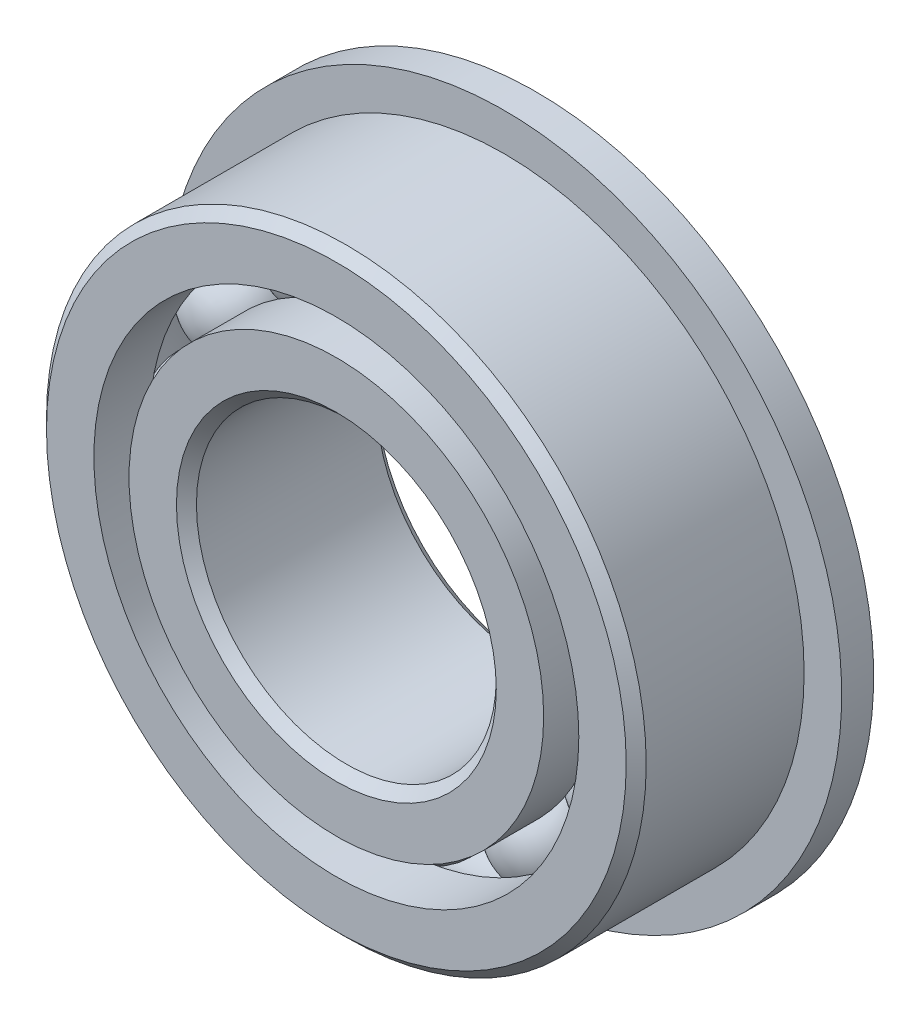
ISO-10303-21;
HEADER;
FILE_DESCRIPTION(('STEP AP214'),'2;1');
FILE_NAME('part.step','',(''),(''),'','','');
FILE_SCHEMA(('AUTOMOTIVE_DESIGN { 1 0 10303 214 1 1 1 1 }'));
ENDSEC;
DATA;
#1=APPLICATION_CONTEXT('core data for automotive mechanical design processes');
#2=APPLICATION_PROTOCOL_DEFINITION('international standard','automotive_design',2000,#1);
#3=PRODUCT_CONTEXT('',#1,'mechanical');
#4=PRODUCT('Part','Part','',(#3));
#5=PRODUCT_RELATED_PRODUCT_CATEGORY('part','',(#4));
#6=PRODUCT_DEFINITION_FORMATION('','',#4);
#7=PRODUCT_DEFINITION_CONTEXT('part definition',#1,'design');
#8=PRODUCT_DEFINITION('design','',#6,#7);
#9=PRODUCT_DEFINITION_SHAPE('','',#8);
#10=(LENGTH_UNIT() NAMED_UNIT(*) SI_UNIT(.MILLI.,.METRE.));
#11=(NAMED_UNIT(*) PLANE_ANGLE_UNIT() SI_UNIT($,.RADIAN.));
#12=(NAMED_UNIT(*) SI_UNIT($,.STERADIAN.) SOLID_ANGLE_UNIT());
#13=UNCERTAINTY_MEASURE_WITH_UNIT(LENGTH_MEASURE(1.E-05),#10,'distance_accuracy_value','');
#14=(GEOMETRIC_REPRESENTATION_CONTEXT(3) GLOBAL_UNCERTAINTY_ASSIGNED_CONTEXT((#13)) GLOBAL_UNIT_ASSIGNED_CONTEXT((#10,
#11,#12)) REPRESENTATION_CONTEXT('',''));
#15=CARTESIAN_POINT('',(0.,0.,0.));
#16=DIRECTION('',(0.,0.,1.));
#17=DIRECTION('',(1.,0.,0.));
#18=AXIS2_PLACEMENT_3D('',#15,#16,#17);
#19=CARTESIAN_POINT('',(-1.78593749999996,3.09333448914257,0.));
#20=DIRECTION('',(0.,0.,1.));
#21=DIRECTION('',(-0.499999999999989,0.866025403784445,0.));
#22=AXIS2_PLACEMENT_3D('',#19,#20,#21);
#23=SPHERICAL_SURFACE('',#22,0.758760243513404);
#24=CARTESIAN_POINT('',(-1.78593749999996,3.09333448914257,0.758760243513404));
#25=VERTEX_POINT('',#24);
#26=VERTEX_LOOP('',#25);
#27=FACE_BOUND('',#26,.T.);
#28=ADVANCED_FACE('F40',(#27),#23,.T.);
#29=CLOSED_SHELL('',(#28));
#30=MANIFOLD_SOLID_BREP('B2',#29);
#31=CARTESIAN_POINT('',(-3.09333448914252,1.78593750000004,0.));
#32=DIRECTION('',(0.,0.,1.));
#33=DIRECTION('',(-0.866025403784433,0.50000000000001,0.));
#34=AXIS2_PLACEMENT_3D('',#31,#32,#33);
#35=SPHERICAL_SURFACE('',#34,0.758760243513404);
#36=CARTESIAN_POINT('',(-3.09333448914252,1.78593750000004,0.758760243513404));
#37=VERTEX_POINT('',#36);
#38=VERTEX_LOOP('',#37);
#39=FACE_BOUND('',#38,.T.);
#40=ADVANCED_FACE('F63',(#39),#35,.T.);
#41=CLOSED_SHELL('',(#40));
#42=MANIFOLD_SOLID_BREP('B6',#41);
#43=CARTESIAN_POINT('',(-3.571875,0.,0.));
#44=DIRECTION('',(0.,0.,1.));
#45=DIRECTION('',(-1.,0.,0.));
#46=AXIS2_PLACEMENT_3D('',#43,#44,#45);
#47=SPHERICAL_SURFACE('',#46,0.758760243513404);
#48=CARTESIAN_POINT('',(-3.571875,0.,0.758760243513404));
#49=VERTEX_POINT('',#48);
#50=VERTEX_LOOP('',#49);
#51=FACE_BOUND('',#50,.T.);
#52=ADVANCED_FACE('F84',(#51),#47,.T.);
#53=CLOSED_SHELL('',(#52));
#54=MANIFOLD_SOLID_BREP('B36',#53);
#55=CARTESIAN_POINT('',(-3.09333448914256,-1.78593749999997,0.));
#56=DIRECTION('',(0.,0.,1.));
#57=DIRECTION('',(-0.866025403784443,-0.499999999999992,0.));
#58=AXIS2_PLACEMENT_3D('',#55,#56,#57);
#59=SPHERICAL_SURFACE('',#58,0.758760243513404);
#60=CARTESIAN_POINT('',(-3.09333448914256,-1.78593749999997,0.758760243513404));
#61=VERTEX_POINT('',#60);
#62=VERTEX_LOOP('',#61);
#63=FACE_BOUND('',#62,.T.);
#64=ADVANCED_FACE('F108',(#63),#59,.T.);
#65=CLOSED_SHELL('',(#64));
#66=MANIFOLD_SOLID_BREP('B59',#65);
#67=CARTESIAN_POINT('',(-1.78593750000003,-3.09333448914253,0.));
#68=DIRECTION('',(0.,0.,1.));
#69=DIRECTION('',(-0.500000000000007,-0.866025403784435,0.));
#70=AXIS2_PLACEMENT_3D('',#67,#68,#69);
#71=SPHERICAL_SURFACE('',#70,0.758760243513404);
#72=CARTESIAN_POINT('',(-1.78593750000003,-3.09333448914253,0.758760243513404));
#73=VERTEX_POINT('',#72);
#74=VERTEX_LOOP('',#73);
#75=FACE_BOUND('',#74,.T.);
#76=ADVANCED_FACE('F132',(#75),#71,.T.);
#77=CLOSED_SHELL('',(#76));
#78=MANIFOLD_SOLID_BREP('B80',#77);
#79=CARTESIAN_POINT('',(0.,-3.571875,0.));
#80=DIRECTION('',(0.,0.,1.));
#81=DIRECTION('',(0.,-1.,0.));
#82=AXIS2_PLACEMENT_3D('',#79,#80,#81);
#83=SPHERICAL_SURFACE('',#82,0.758760243513404);
#84=CARTESIAN_POINT('',(0.,-3.571875,0.758760243513404));
#85=VERTEX_POINT('',#84);
#86=VERTEX_LOOP('',#85);
#87=FACE_BOUND('',#86,.T.);
#88=ADVANCED_FACE('F155',(#87),#83,.T.);
#89=CLOSED_SHELL('',(#88));
#90=MANIFOLD_SOLID_BREP('B104',#89);
#91=CARTESIAN_POINT('',(1.78593749999998,-3.09333448914255,0.));
#92=DIRECTION('',(0.,0.,1.));
#93=DIRECTION('',(0.499999999999995,-0.866025403784442,0.));
#94=AXIS2_PLACEMENT_3D('',#91,#92,#93);
#95=SPHERICAL_SURFACE('',#94,0.758760243513404);
#96=CARTESIAN_POINT('',(1.78593749999998,-3.09333448914255,0.758760243513404));
#97=VERTEX_POINT('',#96);
#98=VERTEX_LOOP('',#97);
#99=FACE_BOUND('',#98,.T.);
#100=ADVANCED_FACE('F176',(#99),#95,.T.);
#101=CLOSED_SHELL('',(#100));
#102=MANIFOLD_SOLID_BREP('B128',#101);
#103=CARTESIAN_POINT('',(3.09333448914253,-1.78593750000001,0.));
#104=DIRECTION('',(0.,0.,1.));
#105=DIRECTION('',(0.866025403784436,-0.500000000000004,0.));
#106=AXIS2_PLACEMENT_3D('',#103,#104,#105);
#107=SPHERICAL_SURFACE('',#106,0.758760243513404);
#108=CARTESIAN_POINT('',(3.09333448914253,-1.78593750000001,0.758760243513404));
#109=VERTEX_POINT('',#108);
#110=VERTEX_LOOP('',#109);
#111=FACE_BOUND('',#110,.T.);
#112=ADVANCED_FACE('F199',(#111),#107,.T.);
#113=CLOSED_SHELL('',(#112));
#114=MANIFOLD_SOLID_BREP('B151',#113);
#115=CARTESIAN_POINT('',(3.571875,0.,0.));
#116=DIRECTION('',(0.,0.,1.));
#117=DIRECTION('',(1.,0.,0.));
#118=AXIS2_PLACEMENT_3D('',#115,#116,#117);
#119=SPHERICAL_SURFACE('',#118,0.758760243513404);
#120=CARTESIAN_POINT('',(3.571875,0.,0.758760243513404));
#121=VERTEX_POINT('',#120);
#122=VERTEX_LOOP('',#121);
#123=FACE_BOUND('',#122,.T.);
#124=ADVANCED_FACE('F219',(#123),#119,.T.);
#125=CLOSED_SHELL('',(#124));
#126=MANIFOLD_SOLID_BREP('B172',#125);
#127=CARTESIAN_POINT('',(3.09333448914255,1.78593749999999,0.));
#128=DIRECTION('',(0.,0.,1.));
#129=DIRECTION('',(0.86602540378444,0.499999999999998,0.));
#130=AXIS2_PLACEMENT_3D('',#127,#128,#129);
#131=SPHERICAL_SURFACE('',#130,0.758760243513404);
#132=CARTESIAN_POINT('',(3.09333448914255,1.78593749999999,0.758760243513404));
#133=VERTEX_POINT('',#132);
#134=VERTEX_LOOP('',#133);
#135=FACE_BOUND('',#134,.T.);
#136=ADVANCED_FACE('F239',(#135),#131,.T.);
#137=CLOSED_SHELL('',(#136));
#138=MANIFOLD_SOLID_BREP('B195',#137);
#139=CARTESIAN_POINT('',(1.7859375,3.09333448914254,0.));
#140=DIRECTION('',(0.,0.,1.));
#141=DIRECTION('',(0.500000000000001,0.866025403784438,0.));
#142=AXIS2_PLACEMENT_3D('',#139,#140,#141);
#143=SPHERICAL_SURFACE('',#142,0.758760243513404);
#144=CARTESIAN_POINT('',(1.7859375,3.09333448914254,0.758760243513404));
#145=VERTEX_POINT('',#144);
#146=VERTEX_LOOP('',#145);
#147=FACE_BOUND('',#146,.T.);
#148=ADVANCED_FACE('F259',(#147),#143,.T.);
#149=CLOSED_SHELL('',(#148));
#150=MANIFOLD_SOLID_BREP('B215',#149);
#151=CARTESIAN_POINT('',(0.,3.571875,0.));
#152=DIRECTION('',(0.,0.,1.));
#153=DIRECTION('',(0.,1.,0.));
#154=AXIS2_PLACEMENT_3D('',#151,#152,#153);
#155=SPHERICAL_SURFACE('',#154,0.758760243513404);
#156=CARTESIAN_POINT('',(0.,3.571875,0.758760243513404));
#157=VERTEX_POINT('',#156);
#158=VERTEX_LOOP('',#157);
#159=FACE_BOUND('',#158,.T.);
#160=ADVANCED_FACE('F282',(#159),#155,.T.);
#161=CLOSED_SHELL('',(#160));
#162=MANIFOLD_SOLID_BREP('B235',#161);
#163=CARTESIAN_POINT('',(0.,3.29275412087912,1.5875));
#164=DIRECTION('',(0.,0.,-1.));
#165=DIRECTION('',(-1.,0.,0.));
#166=AXIS2_PLACEMENT_3D('',#163,#164,#165);
#167=PLANE('',#166);
#168=CARTESIAN_POINT('',(0.,0.,1.5875));
#169=DIRECTION('',(0.,0.,1.));
#170=DIRECTION('',(1.,0.,0.));
#171=AXIS2_PLACEMENT_3D('',#168,#169,#170);
#172=CIRCLE('',#171,2.54);
#173=CARTESIAN_POINT('',(2.54,0.,1.5875));
#174=VERTEX_POINT('',#173);
#175=EDGE_CURVE('E333',#174,#174,#172,.T.);
#176=ORIENTED_EDGE('',*,*,#175,.F.);
#177=EDGE_LOOP('',(#176));
#178=FACE_BOUND('',#177,.T.);
#179=CARTESIAN_POINT('',(0.,0.,1.5875));
#180=DIRECTION('',(0.,0.,1.));
#181=DIRECTION('',(1.,0.,0.));
#182=AXIS2_PLACEMENT_3D('',#179,#180,#181);
#183=CIRCLE('',#182,3.29275412087912);
#184=CARTESIAN_POINT('',(3.29275412087912,0.,1.5875));
#185=VERTEX_POINT('',#184);
#186=EDGE_CURVE('E281',#185,#185,#183,.T.);
#187=ORIENTED_EDGE('',*,*,#186,.T.);
#188=EDGE_LOOP('',(#187));
#189=FACE_BOUND('',#188,.T.);
#190=ADVANCED_FACE('F305',(#178,#189),#167,.F.);
#191=CARTESIAN_POINT('',(0.,0.,1.5875));
#192=DIRECTION('',(0.,0.,1.));
#193=DIRECTION('',(1.,0.,0.));
#194=AXIS2_PLACEMENT_3D('',#191,#192,#193);
#195=CYLINDRICAL_SURFACE('',#194,3.29275412087912);
#196=ORIENTED_EDGE('',*,*,#186,.F.);
#197=EDGE_LOOP('',(#196));
#198=FACE_BOUND('',#197,.T.);
#199=CARTESIAN_POINT('',(0.,0.,0.705555555555555));
#200=DIRECTION('',(0.,0.,1.));
#201=DIRECTION('',(1.,0.,0.));
#202=AXIS2_PLACEMENT_3D('',#199,#200,#201);
#203=CIRCLE('',#202,3.29275412087912);
#204=CARTESIAN_POINT('',(3.29275412087912,0.,0.705555555555555));
#205=VERTEX_POINT('',#204);
#206=EDGE_CURVE('E311',#205,#205,#203,.T.);
#207=ORIENTED_EDGE('',*,*,#206,.T.);
#208=EDGE_LOOP('',(#207));
#209=FACE_BOUND('',#208,.T.);
#210=ADVANCED_FACE('F340',(#198,#209),#195,.T.);
#211=CARTESIAN_POINT('',(0.,0.,0.));
#212=DIRECTION('',(0.,0.,1.));
#213=DIRECTION('',(1.,0.,0.));
#214=AXIS2_PLACEMENT_3D('',#211,#212,#213);
#215=TOROIDAL_SURFACE('',#214,3.57187499999999,0.758760243513403);
#216=ORIENTED_EDGE('',*,*,#206,.F.);
#217=EDGE_LOOP('',(#216));
#218=FACE_BOUND('',#217,.T.);
#219=CARTESIAN_POINT('',(0.,0.,-0.705555555555556));
#220=DIRECTION('',(0.,0.,1.));
#221=DIRECTION('',(1.,0.,0.));
#222=AXIS2_PLACEMENT_3D('',#219,#220,#221);
#223=CIRCLE('',#222,3.29275412087912);
#224=CARTESIAN_POINT('',(3.29275412087912,0.,-0.705555555555556));
#225=VERTEX_POINT('',#224);
#226=EDGE_CURVE('E315',#225,#225,#223,.T.);
#227=ORIENTED_EDGE('',*,*,#226,.T.);
#228=EDGE_LOOP('',(#227));
#229=FACE_BOUND('',#228,.T.);
#230=ADVANCED_FACE('F344',(#218,#229),#215,.F.);
#231=CARTESIAN_POINT('',(0.,0.,1.5875));
#232=DIRECTION('',(0.,0.,1.));
#233=DIRECTION('',(1.,0.,0.));
#234=AXIS2_PLACEMENT_3D('',#231,#232,#233);
#235=CYLINDRICAL_SURFACE('',#234,3.29275412087912);
#236=ORIENTED_EDGE('',*,*,#226,.F.);
#237=EDGE_LOOP('',(#236));
#238=FACE_BOUND('',#237,.T.);
#239=CARTESIAN_POINT('',(0.,0.,-1.5875));
#240=DIRECTION('',(0.,0.,1.));
#241=DIRECTION('',(1.,0.,0.));
#242=AXIS2_PLACEMENT_3D('',#239,#240,#241);
#243=CIRCLE('',#242,3.29275412087912);
#244=CARTESIAN_POINT('',(3.29275412087912,0.,-1.5875));
#245=VERTEX_POINT('',#244);
#246=EDGE_CURVE('E319',#245,#245,#243,.T.);
#247=ORIENTED_EDGE('',*,*,#246,.T.);
#248=EDGE_LOOP('',(#247));
#249=FACE_BOUND('',#248,.T.);
#250=ADVANCED_FACE('F349',(#238,#249),#235,.T.);
#251=CARTESIAN_POINT('',(0.,2.54,-1.5875));
#252=DIRECTION('',(0.,0.,1.));
#253=DIRECTION('',(1.,0.,0.));
#254=AXIS2_PLACEMENT_3D('',#251,#252,#253);
#255=PLANE('',#254);
#256=ORIENTED_EDGE('',*,*,#246,.F.);
#257=EDGE_LOOP('',(#256));
#258=FACE_BOUND('',#257,.T.);
#259=CARTESIAN_POINT('',(0.,0.,-1.5875));
#260=DIRECTION('',(0.,0.,1.));
#261=DIRECTION('',(1.,0.,0.));
#262=AXIS2_PLACEMENT_3D('',#259,#260,#261);
#263=CIRCLE('',#262,2.54);
#264=CARTESIAN_POINT('',(2.54,0.,-1.5875));
#265=VERTEX_POINT('',#264);
#266=EDGE_CURVE('E324',#265,#265,#263,.T.);
#267=ORIENTED_EDGE('',*,*,#266,.T.);
#268=EDGE_LOOP('',(#267));
#269=FACE_BOUND('',#268,.T.);
#270=ADVANCED_FACE('F355',(#258,#269),#255,.F.);
#271=CARTESIAN_POINT('',(0.,0.,-1.42875));
#272=DIRECTION('',(0.,0.,-1.));
#273=DIRECTION('',(-1.,0.,0.));
#274=AXIS2_PLACEMENT_3D('',#271,#272,#273);
#275=CONICAL_SURFACE('',#274,2.38125,0.78539816339745);
#276=ORIENTED_EDGE('',*,*,#266,.F.);
#277=EDGE_LOOP('',(#276));
#278=FACE_BOUND('',#277,.T.);
#279=CARTESIAN_POINT('',(0.,0.,-1.42875));
#280=DIRECTION('',(0.,0.,1.));
#281=DIRECTION('',(1.,0.,0.));
#282=AXIS2_PLACEMENT_3D('',#279,#280,#281);
#283=CIRCLE('',#282,2.38125);
#284=CARTESIAN_POINT('',(2.38125,0.,-1.42875));
#285=VERTEX_POINT('',#284);
#286=EDGE_CURVE('E327',#285,#285,#283,.T.);
#287=ORIENTED_EDGE('',*,*,#286,.T.);
#288=EDGE_LOOP('',(#287));
#289=FACE_BOUND('',#288,.T.);
#290=ADVANCED_FACE('F359',(#278,#289),#275,.F.);
#291=CARTESIAN_POINT('',(0.,0.,1.5875));
#292=DIRECTION('',(0.,0.,1.));
#293=DIRECTION('',(1.,0.,0.));
#294=AXIS2_PLACEMENT_3D('',#291,#292,#293);
#295=CYLINDRICAL_SURFACE('',#294,2.38125);
#296=ORIENTED_EDGE('',*,*,#286,.F.);
#297=EDGE_LOOP('',(#296));
#298=FACE_BOUND('',#297,.T.);
#299=CARTESIAN_POINT('',(0.,0.,1.42875));
#300=DIRECTION('',(0.,0.,1.));
#301=DIRECTION('',(1.,0.,0.));
#302=AXIS2_PLACEMENT_3D('',#299,#300,#301);
#303=CIRCLE('',#302,2.38125);
#304=CARTESIAN_POINT('',(2.38125,0.,1.42875));
#305=VERTEX_POINT('',#304);
#306=EDGE_CURVE('E330',#305,#305,#303,.T.);
#307=ORIENTED_EDGE('',*,*,#306,.T.);
#308=EDGE_LOOP('',(#307));
#309=FACE_BOUND('',#308,.T.);
#310=ADVANCED_FACE('F363',(#298,#309),#295,.F.);
#311=CARTESIAN_POINT('',(0.,0.,1.5875));
#312=DIRECTION('',(0.,0.,1.));
#313=DIRECTION('',(1.,0.,0.));
#314=AXIS2_PLACEMENT_3D('',#311,#312,#313);
#315=CONICAL_SURFACE('',#314,2.54,0.785398163397452);
#316=ORIENTED_EDGE('',*,*,#306,.F.);
#317=EDGE_LOOP('',(#316));
#318=FACE_BOUND('',#317,.T.);
#319=ORIENTED_EDGE('',*,*,#175,.T.);
#320=EDGE_LOOP('',(#319));
#321=FACE_BOUND('',#320,.T.);
#322=ADVANCED_FACE('F337',(#318,#321),#315,.F.);
#323=CLOSED_SHELL('',(#190,#210,#230,#250,#270,#290,#310,#322));
#324=MANIFOLD_SOLID_BREP('B255',#323);
#325=CARTESIAN_POINT('',(0.,0.,1.42875));
#326=DIRECTION('',(0.,0.,-1.));
#327=DIRECTION('',(-1.,0.,0.));
#328=AXIS2_PLACEMENT_3D('',#325,#326,#327);
#329=CONICAL_SURFACE('',#328,4.7625,0.785398163397449);
#330=CARTESIAN_POINT('',(0.,0.,1.5875));
#331=DIRECTION('',(0.,0.,1.));
#332=DIRECTION('',(1.,0.,0.));
#333=AXIS2_PLACEMENT_3D('',#330,#331,#332);
#334=CIRCLE('',#333,4.60375);
#335=CARTESIAN_POINT('',(4.60375,0.,1.5875));
#336=VERTEX_POINT('',#335);
#337=EDGE_CURVE('E451',#336,#336,#334,.T.);
#338=ORIENTED_EDGE('',*,*,#337,.F.);
#339=EDGE_LOOP('',(#338));
#340=FACE_BOUND('',#339,.T.);
#341=CARTESIAN_POINT('',(0.,0.,1.42875));
#342=DIRECTION('',(0.,0.,1.));
#343=DIRECTION('',(1.,0.,0.));
#344=AXIS2_PLACEMENT_3D('',#341,#342,#343);
#345=CIRCLE('',#344,4.7625);
#346=CARTESIAN_POINT('',(4.7625,0.,1.42875));
#347=VERTEX_POINT('',#346);
#348=EDGE_CURVE('E304',#347,#347,#345,.T.);
#349=ORIENTED_EDGE('',*,*,#348,.T.);
#350=EDGE_LOOP('',(#349));
#351=FACE_BOUND('',#350,.T.);
#352=ADVANCED_FACE('F429',(#340,#351),#329,.T.);
#353=CARTESIAN_POINT('',(0.,0.,1.5875));
#354=DIRECTION('',(0.,0.,1.));
#355=DIRECTION('',(1.,0.,0.));
#356=AXIS2_PLACEMENT_3D('',#353,#354,#355);
#357=CYLINDRICAL_SURFACE('',#356,4.7625);
#358=CARTESIAN_POINT('',(0.,0.,-1.0795));
#359=DIRECTION('',(0.,0.,1.));
#360=DIRECTION('',(1.,0.,0.));
#361=AXIS2_PLACEMENT_3D('',#358,#359,#360);
#362=CIRCLE('',#361,4.7625);
#363=CARTESIAN_POINT('',(4.7625,0.,-1.0795));
#364=VERTEX_POINT('',#363);
#365=EDGE_CURVE('E454',#364,#364,#362,.T.);
#366=ORIENTED_EDGE('',*,*,#365,.T.);
#367=EDGE_LOOP('',(#366));
#368=FACE_BOUND('',#367,.T.);
#369=ORIENTED_EDGE('',*,*,#348,.F.);
#370=EDGE_LOOP('',(#369));
#371=FACE_BOUND('',#370,.T.);
#372=ADVANCED_FACE('F474',(#368,#371),#357,.T.);
#373=CARTESIAN_POINT('',(0.,4.60375,-1.5875));
#374=DIRECTION('',(0.,0.,1.));
#375=DIRECTION('',(1.,0.,0.));
#376=AXIS2_PLACEMENT_3D('',#373,#374,#375);
#377=PLANE('',#376);
#378=CARTESIAN_POINT('',(0.,0.,-1.5875));
#379=DIRECTION('',(0.,0.,1.));
#380=DIRECTION('',(1.,0.,0.));
#381=AXIS2_PLACEMENT_3D('',#378,#379,#380);
#382=CIRCLE('',#381,3.85099587912088);
#383=CARTESIAN_POINT('',(3.85099587912088,0.,-1.5875));
#384=VERTEX_POINT('',#383);
#385=EDGE_CURVE('E435',#384,#384,#382,.T.);
#386=ORIENTED_EDGE('',*,*,#385,.T.);
#387=EDGE_LOOP('',(#386));
#388=FACE_BOUND('',#387,.T.);
#389=CARTESIAN_POINT('',(0.,0.,-1.5875));
#390=DIRECTION('',(0.,0.,-1.));
#391=DIRECTION('',(-1.,0.,0.));
#392=AXIS2_PLACEMENT_3D('',#389,#390,#391);
#393=CIRCLE('',#392,5.3594);
#394=CARTESIAN_POINT('',(-5.3594,0.,-1.5875));
#395=VERTEX_POINT('',#394);
#396=EDGE_CURVE('E457',#395,#395,#393,.T.);
#397=ORIENTED_EDGE('',*,*,#396,.T.);
#398=EDGE_LOOP('',(#397));
#399=FACE_BOUND('',#398,.T.);
#400=ADVANCED_FACE('F477',(#388,#399),#377,.F.);
#401=CARTESIAN_POINT('',(0.,0.,1.5875));
#402=DIRECTION('',(0.,0.,1.));
#403=DIRECTION('',(1.,0.,0.));
#404=AXIS2_PLACEMENT_3D('',#401,#402,#403);
#405=CYLINDRICAL_SURFACE('',#404,3.85099587912088);
#406=CARTESIAN_POINT('',(0.,0.,-0.705555555555556));
#407=DIRECTION('',(0.,0.,1.));
#408=DIRECTION('',(1.,0.,0.));
#409=AXIS2_PLACEMENT_3D('',#406,#407,#408);
#410=CIRCLE('',#409,3.85099587912088);
#411=CARTESIAN_POINT('',(3.85099587912088,0.,-0.705555555555556));
#412=VERTEX_POINT('',#411);
#413=EDGE_CURVE('E439',#412,#412,#410,.T.);
#414=ORIENTED_EDGE('',*,*,#413,.T.);
#415=EDGE_LOOP('',(#414));
#416=FACE_BOUND('',#415,.T.);
#417=ORIENTED_EDGE('',*,*,#385,.F.);
#418=EDGE_LOOP('',(#417));
#419=FACE_BOUND('',#418,.T.);
#420=ADVANCED_FACE('F482',(#416,#419),#405,.F.);
#421=CARTESIAN_POINT('',(0.,0.,0.));
#422=DIRECTION('',(0.,0.,1.));
#423=DIRECTION('',(1.,0.,0.));
#424=AXIS2_PLACEMENT_3D('',#421,#422,#423);
#425=TOROIDAL_SURFACE('',#424,3.571875,0.758760243513404);
#426=ORIENTED_EDGE('',*,*,#413,.F.);
#427=EDGE_LOOP('',(#426));
#428=FACE_BOUND('',#427,.T.);
#429=CARTESIAN_POINT('',(0.,0.,0.705555555555555));
#430=DIRECTION('',(0.,0.,1.));
#431=DIRECTION('',(1.,0.,0.));
#432=AXIS2_PLACEMENT_3D('',#429,#430,#431);
#433=CIRCLE('',#432,3.85099587912088);
#434=CARTESIAN_POINT('',(3.85099587912088,0.,0.705555555555555));
#435=VERTEX_POINT('',#434);
#436=EDGE_CURVE('E443',#435,#435,#433,.T.);
#437=ORIENTED_EDGE('',*,*,#436,.T.);
#438=EDGE_LOOP('',(#437));
#439=FACE_BOUND('',#438,.T.);
#440=ADVANCED_FACE('F488',(#428,#439),#425,.F.);
#441=CARTESIAN_POINT('',(0.,0.,1.5875));
#442=DIRECTION('',(0.,0.,1.));
#443=DIRECTION('',(1.,0.,0.));
#444=AXIS2_PLACEMENT_3D('',#441,#442,#443);
#445=CYLINDRICAL_SURFACE('',#444,3.85099587912088);
#446=ORIENTED_EDGE('',*,*,#436,.F.);
#447=EDGE_LOOP('',(#446));
#448=FACE_BOUND('',#447,.T.);
#449=CARTESIAN_POINT('',(0.,0.,1.5875));
#450=DIRECTION('',(0.,0.,1.));
#451=DIRECTION('',(1.,0.,0.));
#452=AXIS2_PLACEMENT_3D('',#449,#450,#451);
#453=CIRCLE('',#452,3.85099587912088);
#454=CARTESIAN_POINT('',(3.85099587912088,0.,1.5875));
#455=VERTEX_POINT('',#454);
#456=EDGE_CURVE('E448',#455,#455,#453,.T.);
#457=ORIENTED_EDGE('',*,*,#456,.T.);
#458=EDGE_LOOP('',(#457));
#459=FACE_BOUND('',#458,.T.);
#460=ADVANCED_FACE('F492',(#448,#459),#445,.F.);
#461=CARTESIAN_POINT('',(0.,4.60375,1.5875));
#462=DIRECTION('',(0.,0.,-1.));
#463=DIRECTION('',(-1.,0.,0.));
#464=AXIS2_PLACEMENT_3D('',#461,#462,#463);
#465=PLANE('',#464);
#466=ORIENTED_EDGE('',*,*,#456,.F.);
#467=EDGE_LOOP('',(#466));
#468=FACE_BOUND('',#467,.T.);
#469=ORIENTED_EDGE('',*,*,#337,.T.);
#470=EDGE_LOOP('',(#469));
#471=FACE_BOUND('',#470,.T.);
#472=ADVANCED_FACE('F470',(#468,#471),#465,.F.);
#473=CARTESIAN_POINT('',(0.,3.85099587912088,-1.0795));
#474=DIRECTION('',(0.,0.,1.));
#475=DIRECTION('',(1.,0.,0.));
#476=AXIS2_PLACEMENT_3D('',#473,#474,#475);
#477=PLANE('',#476);
#478=CARTESIAN_POINT('',(0.,0.,-1.0795));
#479=DIRECTION('',(0.,0.,-1.));
#480=DIRECTION('',(-1.,0.,0.));
#481=AXIS2_PLACEMENT_3D('',#478,#479,#480);
#482=CIRCLE('',#481,5.3594);
#483=CARTESIAN_POINT('',(-5.3594,0.,-1.0795));
#484=VERTEX_POINT('',#483);
#485=EDGE_CURVE('E460',#484,#484,#482,.T.);
#486=ORIENTED_EDGE('',*,*,#485,.F.);
#487=EDGE_LOOP('',(#486));
#488=FACE_BOUND('',#487,.T.);
#489=ORIENTED_EDGE('',*,*,#365,.F.);
#490=EDGE_LOOP('',(#489));
#491=FACE_BOUND('',#490,.T.);
#492=ADVANCED_FACE('F467',(#488,#491),#477,.T.);
#493=CARTESIAN_POINT('',(0.,0.,-1.5875));
#494=DIRECTION('',(0.,0.,-1.));
#495=DIRECTION('',(-1.,0.,0.));
#496=AXIS2_PLACEMENT_3D('',#493,#494,#495);
#497=CYLINDRICAL_SURFACE('',#496,5.3594);
#498=ORIENTED_EDGE('',*,*,#485,.T.);
#499=EDGE_LOOP('',(#498));
#500=FACE_BOUND('',#499,.T.);
#501=ORIENTED_EDGE('',*,*,#396,.F.);
#502=EDGE_LOOP('',(#501));
#503=FACE_BOUND('',#502,.T.);
#504=ADVANCED_FACE('F464',(#500,#503),#497,.T.);
#505=CLOSED_SHELL('',(#352,#372,#400,#420,#440,#460,#472,#492,#504));
#506=MANIFOLD_SOLID_BREP('B276',#505);
#507=ADVANCED_BREP_SHAPE_REPRESENTATION('',(#18,#30,#42,#54,#66,#78,#90,#102,#114,#126,#138,
#150,#162,#324,#506),#14);
#508=SHAPE_DEFINITION_REPRESENTATION(#9,#507);
ENDSEC;
END-ISO-10303-21;
